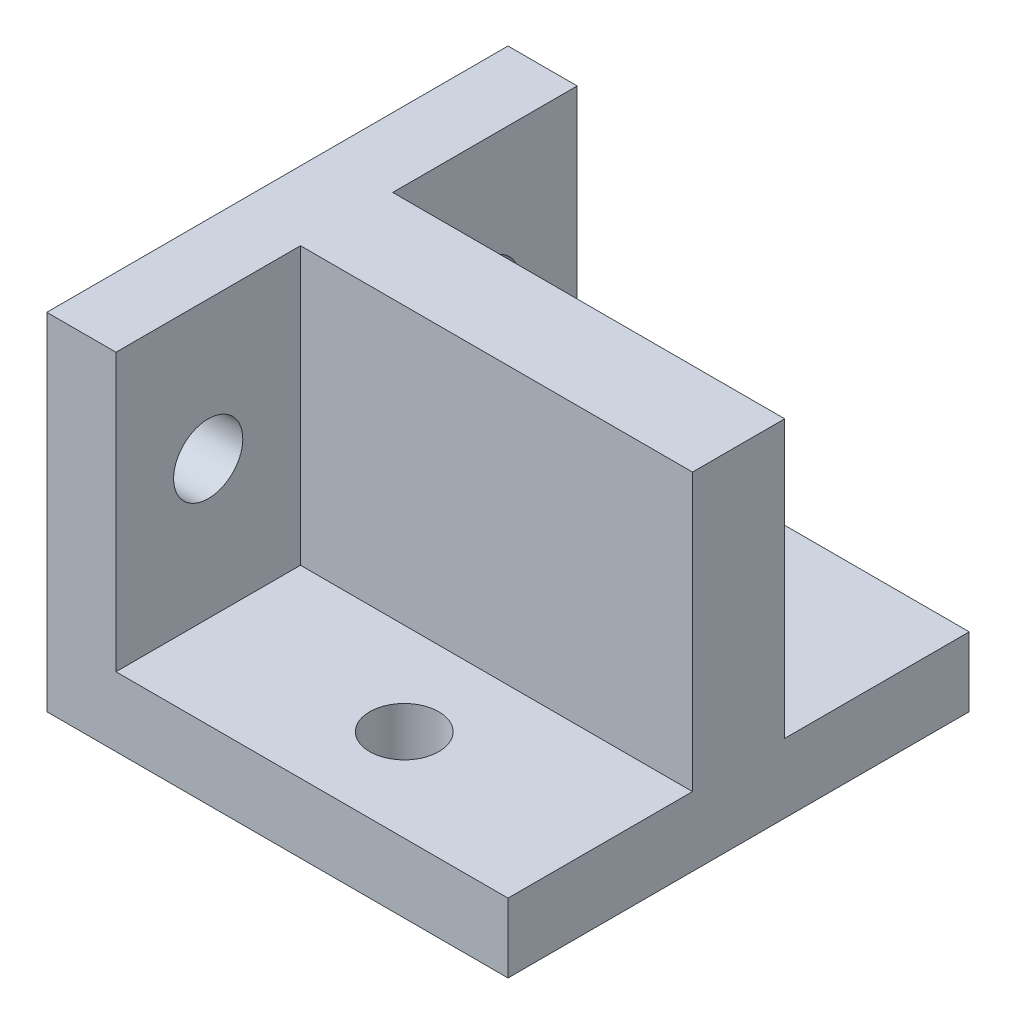
ISO-10303-21;
HEADER;
FILE_DESCRIPTION(('STEP AP214'),'2;1');
FILE_NAME('part.step','',(''),(''),'','','');
FILE_SCHEMA(('AUTOMOTIVE_DESIGN { 1 0 10303 214 1 1 1 1 }'));
ENDSEC;
DATA;
#1=APPLICATION_CONTEXT('core data for automotive mechanical design processes');
#2=APPLICATION_PROTOCOL_DEFINITION('international standard','automotive_design',2000,#1);
#3=PRODUCT_CONTEXT('',#1,'mechanical');
#4=PRODUCT('Part','Part','',(#3));
#5=PRODUCT_RELATED_PRODUCT_CATEGORY('part','',(#4));
#6=PRODUCT_DEFINITION_FORMATION('','',#4);
#7=PRODUCT_DEFINITION_CONTEXT('part definition',#1,'design');
#8=PRODUCT_DEFINITION('design','',#6,#7);
#9=PRODUCT_DEFINITION_SHAPE('','',#8);
#10=(LENGTH_UNIT() NAMED_UNIT(*) SI_UNIT(.MILLI.,.METRE.));
#11=(NAMED_UNIT(*) PLANE_ANGLE_UNIT() SI_UNIT($,.RADIAN.));
#12=(NAMED_UNIT(*) SI_UNIT($,.STERADIAN.) SOLID_ANGLE_UNIT());
#13=UNCERTAINTY_MEASURE_WITH_UNIT(LENGTH_MEASURE(1.E-05),#10,'distance_accuracy_value','');
#14=(GEOMETRIC_REPRESENTATION_CONTEXT(3) GLOBAL_UNCERTAINTY_ASSIGNED_CONTEXT((#13)) GLOBAL_UNIT_ASSIGNED_CONTEXT((#10,
#11,#12)) REPRESENTATION_CONTEXT('',''));
#15=CARTESIAN_POINT('',(0.,0.,0.));
#16=DIRECTION('',(0.,0.,1.));
#17=DIRECTION('',(1.,0.,0.));
#18=AXIS2_PLACEMENT_3D('',#15,#16,#17);
#19=CARTESIAN_POINT('',(17.,0.,20.));
#20=DIRECTION('',(0.,-1.,0.));
#21=DIRECTION('',(1.,0.,0.));
#22=AXIS2_PLACEMENT_3D('',#19,#20,#21);
#23=PLANE('',#22);
#24=CARTESIAN_POINT('',(8.5,0.,4.));
#25=DIRECTION('',(0.,1.,0.));
#26=DIRECTION('',(1.,0.,0.));
#27=AXIS2_PLACEMENT_3D('',#24,#25,#26);
#28=CIRCLE('',#27,1.5);
#29=CARTESIAN_POINT('',(10.,0.,4.));
#30=VERTEX_POINT('',#29);
#31=EDGE_CURVE('E161',#30,#30,#28,.T.);
#32=ORIENTED_EDGE('',*,*,#31,.F.);
#33=EDGE_LOOP('',(#32));
#34=FACE_BOUND('',#33,.T.);
#35=DIRECTION('',(-1.,0.,0.));
#36=VECTOR('',#35,1.);
#37=CARTESIAN_POINT('',(29.6491106406735,0.,8.));
#38=LINE('',#37,#36);
#39=CARTESIAN_POINT('',(17.,0.,8.));
#40=VERTEX_POINT('',#39);
#41=CARTESIAN_POINT('',(0.,0.,8.));
#42=VERTEX_POINT('',#41);
#43=EDGE_CURVE('E135',#40,#42,#38,.T.);
#44=ORIENTED_EDGE('',*,*,#43,.F.);
#45=DIRECTION('',(0.,0.,-1.));
#46=VECTOR('',#45,1.);
#47=CARTESIAN_POINT('',(17.,0.,20.));
#48=LINE('',#47,#46);
#49=CARTESIAN_POINT('',(17.,0.,0.));
#50=VERTEX_POINT('',#49);
#51=EDGE_CURVE('E123',#40,#50,#48,.T.);
#52=ORIENTED_EDGE('',*,*,#51,.T.);
#53=DIRECTION('',(-1.,0.,0.));
#54=VECTOR('',#53,1.);
#55=CARTESIAN_POINT('',(17.,0.,0.));
#56=LINE('',#55,#54);
#57=CARTESIAN_POINT('',(0.,0.,0.));
#58=VERTEX_POINT('',#57);
#59=EDGE_CURVE('E169',#50,#58,#56,.T.);
#60=ORIENTED_EDGE('',*,*,#59,.T.);
#61=DIRECTION('',(0.,0.,-1.));
#62=VECTOR('',#61,1.);
#63=CARTESIAN_POINT('',(0.,0.,20.));
#64=LINE('',#63,#62);
#65=EDGE_CURVE('E47',#42,#58,#64,.T.);
#66=ORIENTED_EDGE('',*,*,#65,.F.);
#67=EDGE_LOOP('',(#44,#52,#60,#66));
#68=FACE_BOUND('',#67,.T.);
#69=ADVANCED_FACE('F39',(#34,#68),#23,.F.);
#70=CARTESIAN_POINT('',(8.5,0.,16.));
#71=DIRECTION('',(0.,1.,0.));
#72=DIRECTION('',(-1.,0.,0.));
#73=AXIS2_PLACEMENT_3D('',#70,#71,#72);
#74=CIRCLE('',#73,1.5);
#75=CARTESIAN_POINT('',(7.,0.,16.));
#76=VERTEX_POINT('',#75);
#77=EDGE_CURVE('E153',#76,#76,#74,.T.);
#78=ORIENTED_EDGE('',*,*,#77,.F.);
#79=EDGE_LOOP('',(#78));
#80=FACE_BOUND('',#79,.T.);
#81=DIRECTION('',(-1.,0.,0.));
#82=VECTOR('',#81,1.);
#83=CARTESIAN_POINT('',(29.6491106406735,0.,12.));
#84=LINE('',#83,#82);
#85=CARTESIAN_POINT('',(17.,0.,12.));
#86=VERTEX_POINT('',#85);
#87=CARTESIAN_POINT('',(0.,0.,12.));
#88=VERTEX_POINT('',#87);
#89=EDGE_CURVE('E62',#86,#88,#84,.T.);
#90=ORIENTED_EDGE('',*,*,#89,.T.);
#91=CARTESIAN_POINT('',(0.,0.,20.));
#92=VERTEX_POINT('',#91);
#93=EDGE_CURVE('E11',#92,#88,#64,.T.);
#94=ORIENTED_EDGE('',*,*,#93,.F.);
#95=DIRECTION('',(-1.,0.,0.));
#96=VECTOR('',#95,1.);
#97=CARTESIAN_POINT('',(17.,0.,20.));
#98=LINE('',#97,#96);
#99=CARTESIAN_POINT('',(17.,0.,20.));
#100=VERTEX_POINT('',#99);
#101=EDGE_CURVE('E181',#100,#92,#98,.T.);
#102=ORIENTED_EDGE('',*,*,#101,.F.);
#103=EDGE_CURVE('E219',#100,#86,#48,.T.);
#104=ORIENTED_EDGE('',*,*,#103,.T.);
#105=EDGE_LOOP('',(#90,#94,#102,#104));
#106=FACE_BOUND('',#105,.T.);
#107=ADVANCED_FACE('F277',(#80,#106),#23,.F.);
#108=CARTESIAN_POINT('',(0.,0.,20.));
#109=DIRECTION('',(-1.,0.,0.));
#110=DIRECTION('',(0.,-1.,0.));
#111=AXIS2_PLACEMENT_3D('',#108,#109,#110);
#112=PLANE('',#111);
#113=CARTESIAN_POINT('',(0.,6.,4.));
#114=DIRECTION('',(1.,0.,0.));
#115=DIRECTION('',(0.,-1.,0.));
#116=AXIS2_PLACEMENT_3D('',#113,#114,#115);
#117=CIRCLE('',#116,1.5);
#118=CARTESIAN_POINT('',(0.,4.5,4.));
#119=VERTEX_POINT('',#118);
#120=EDGE_CURVE('E152',#119,#119,#117,.T.);
#121=ORIENTED_EDGE('',*,*,#120,.F.);
#122=EDGE_LOOP('',(#121));
#123=FACE_BOUND('',#122,.T.);
#124=DIRECTION('',(0.,1.,0.));
#125=VECTOR('',#124,1.);
#126=CARTESIAN_POINT('',(0.,12.,8.));
#127=LINE('',#126,#125);
#128=CARTESIAN_POINT('',(0.,12.,8.));
#129=VERTEX_POINT('',#128);
#130=EDGE_CURVE('E54',#42,#129,#127,.T.);
#131=ORIENTED_EDGE('',*,*,#130,.F.);
#132=ORIENTED_EDGE('',*,*,#65,.T.);
#133=DIRECTION('',(0.,1.,0.));
#134=VECTOR('',#133,1.);
#135=CARTESIAN_POINT('',(0.,0.,0.));
#136=LINE('',#135,#134);
#137=CARTESIAN_POINT('',(0.,12.,0.));
#138=VERTEX_POINT('',#137);
#139=EDGE_CURVE('E204',#58,#138,#136,.T.);
#140=ORIENTED_EDGE('',*,*,#139,.T.);
#141=DIRECTION('',(0.,0.,-1.));
#142=VECTOR('',#141,1.);
#143=CARTESIAN_POINT('',(0.,12.,20.));
#144=LINE('',#143,#142);
#145=EDGE_CURVE('E233',#129,#138,#144,.T.);
#146=ORIENTED_EDGE('',*,*,#145,.F.);
#147=EDGE_LOOP('',(#131,#132,#140,#146));
#148=FACE_BOUND('',#147,.T.);
#149=ADVANCED_FACE('F243',(#123,#148),#112,.F.);
#150=CARTESIAN_POINT('',(0.,6.,16.));
#151=DIRECTION('',(1.,0.,0.));
#152=DIRECTION('',(0.,1.,0.));
#153=AXIS2_PLACEMENT_3D('',#150,#151,#152);
#154=CIRCLE('',#153,1.5);
#155=CARTESIAN_POINT('',(0.,7.5,16.));
#156=VERTEX_POINT('',#155);
#157=EDGE_CURVE('E170',#156,#156,#154,.T.);
#158=ORIENTED_EDGE('',*,*,#157,.F.);
#159=EDGE_LOOP('',(#158));
#160=FACE_BOUND('',#159,.T.);
#161=DIRECTION('',(0.,-1.,0.));
#162=VECTOR('',#161,1.);
#163=CARTESIAN_POINT('',(0.,12.,12.));
#164=LINE('',#163,#162);
#165=CARTESIAN_POINT('',(0.,12.,12.));
#166=VERTEX_POINT('',#165);
#167=EDGE_CURVE('E266',#166,#88,#164,.T.);
#168=ORIENTED_EDGE('',*,*,#167,.F.);
#169=CARTESIAN_POINT('',(0.,12.,20.));
#170=VERTEX_POINT('',#169);
#171=EDGE_CURVE('E234',#170,#166,#144,.T.);
#172=ORIENTED_EDGE('',*,*,#171,.F.);
#173=DIRECTION('',(0.,1.,0.));
#174=VECTOR('',#173,1.);
#175=CARTESIAN_POINT('',(0.,0.,20.));
#176=LINE('',#175,#174);
#177=EDGE_CURVE('E185',#92,#170,#176,.T.);
#178=ORIENTED_EDGE('',*,*,#177,.F.);
#179=ORIENTED_EDGE('',*,*,#93,.T.);
#180=EDGE_LOOP('',(#168,#172,#178,#179));
#181=FACE_BOUND('',#180,.T.);
#182=ADVANCED_FACE('F264',(#160,#181),#112,.F.);
#183=CARTESIAN_POINT('',(0.,12.,20.));
#184=DIRECTION('',(0.,-1.,0.));
#185=DIRECTION('',(1.,0.,0.));
#186=AXIS2_PLACEMENT_3D('',#183,#184,#185);
#187=PLANE('',#186);
#188=DIRECTION('',(-1.,0.,0.));
#189=VECTOR('',#188,1.);
#190=CARTESIAN_POINT('',(0.,12.,0.));
#191=LINE('',#190,#189);
#192=CARTESIAN_POINT('',(-3.,12.,0.));
#193=VERTEX_POINT('',#192);
#194=EDGE_CURVE('E208',#138,#193,#191,.T.);
#195=ORIENTED_EDGE('',*,*,#194,.T.);
#196=DIRECTION('',(0.,0.,-1.));
#197=VECTOR('',#196,1.);
#198=CARTESIAN_POINT('',(-3.,12.,20.));
#199=LINE('',#198,#197);
#200=CARTESIAN_POINT('',(-3.,12.,20.));
#201=VERTEX_POINT('',#200);
#202=EDGE_CURVE('E230',#201,#193,#199,.T.);
#203=ORIENTED_EDGE('',*,*,#202,.F.);
#204=DIRECTION('',(-1.,0.,0.));
#205=VECTOR('',#204,1.);
#206=CARTESIAN_POINT('',(0.,12.,20.));
#207=LINE('',#206,#205);
#208=EDGE_CURVE('E189',#170,#201,#207,.T.);
#209=ORIENTED_EDGE('',*,*,#208,.F.);
#210=ORIENTED_EDGE('',*,*,#171,.T.);
#211=DIRECTION('',(-1.,0.,0.));
#212=VECTOR('',#211,1.);
#213=CARTESIAN_POINT('',(29.6491106406735,12.,12.));
#214=LINE('',#213,#212);
#215=CARTESIAN_POINT('',(17.,12.,12.));
#216=VERTEX_POINT('',#215);
#217=EDGE_CURVE('E136',#216,#166,#214,.T.);
#218=ORIENTED_EDGE('',*,*,#217,.F.);
#219=DIRECTION('',(0.,0.,-1.));
#220=VECTOR('',#219,1.);
#221=CARTESIAN_POINT('',(17.,12.,12.));
#222=LINE('',#221,#220);
#223=CARTESIAN_POINT('',(17.,12.,8.));
#224=VERTEX_POINT('',#223);
#225=EDGE_CURVE('E121',#216,#224,#222,.T.);
#226=ORIENTED_EDGE('',*,*,#225,.T.);
#227=DIRECTION('',(-1.,0.,0.));
#228=VECTOR('',#227,1.);
#229=CARTESIAN_POINT('',(29.6491106406735,12.,8.));
#230=LINE('',#229,#228);
#231=EDGE_CURVE('E131',#224,#129,#230,.T.);
#232=ORIENTED_EDGE('',*,*,#231,.T.);
#233=ORIENTED_EDGE('',*,*,#145,.T.);
#234=EDGE_LOOP('',(#195,#203,#209,#210,#218,#226,#232,#233));
#235=FACE_BOUND('',#234,.T.);
#236=ADVANCED_FACE('F139',(#235),#187,.F.);
#237=CARTESIAN_POINT('',(-3.,12.,20.));
#238=DIRECTION('',(1.,0.,0.));
#239=DIRECTION('',(0.,1.,0.));
#240=AXIS2_PLACEMENT_3D('',#237,#238,#239);
#241=PLANE('',#240);
#242=CARTESIAN_POINT('',(-3.,6.,16.));
#243=DIRECTION('',(1.,0.,0.));
#244=DIRECTION('',(0.,1.,0.));
#245=AXIS2_PLACEMENT_3D('',#242,#243,#244);
#246=CIRCLE('',#245,1.5);
#247=CARTESIAN_POINT('',(-3.,7.5,16.));
#248=VERTEX_POINT('',#247);
#249=EDGE_CURVE('E165',#248,#248,#246,.T.);
#250=ORIENTED_EDGE('',*,*,#249,.T.);
#251=EDGE_LOOP('',(#250));
#252=FACE_BOUND('',#251,.T.);
#253=CARTESIAN_POINT('',(-3.,6.,4.));
#254=DIRECTION('',(1.,0.,0.));
#255=DIRECTION('',(0.,-1.,0.));
#256=AXIS2_PLACEMENT_3D('',#253,#254,#255);
#257=CIRCLE('',#256,1.5);
#258=CARTESIAN_POINT('',(-3.,4.5,4.));
#259=VERTEX_POINT('',#258);
#260=EDGE_CURVE('E174',#259,#259,#257,.T.);
#261=ORIENTED_EDGE('',*,*,#260,.T.);
#262=EDGE_LOOP('',(#261));
#263=FACE_BOUND('',#262,.T.);
#264=DIRECTION('',(0.,-1.,0.));
#265=VECTOR('',#264,1.);
#266=CARTESIAN_POINT('',(-3.,12.,0.));
#267=LINE('',#266,#265);
#268=CARTESIAN_POINT('',(-3.,-3.,0.));
#269=VERTEX_POINT('',#268);
#270=EDGE_CURVE('E211',#193,#269,#267,.T.);
#271=ORIENTED_EDGE('',*,*,#270,.T.);
#272=DIRECTION('',(0.,0.,-1.));
#273=VECTOR('',#272,1.);
#274=CARTESIAN_POINT('',(-3.,-3.,20.));
#275=LINE('',#274,#273);
#276=CARTESIAN_POINT('',(-3.,-3.,20.));
#277=VERTEX_POINT('',#276);
#278=EDGE_CURVE('E226',#277,#269,#275,.T.);
#279=ORIENTED_EDGE('',*,*,#278,.F.);
#280=DIRECTION('',(0.,-1.,0.));
#281=VECTOR('',#280,1.);
#282=CARTESIAN_POINT('',(-3.,12.,20.));
#283=LINE('',#282,#281);
#284=EDGE_CURVE('E192',#201,#277,#283,.T.);
#285=ORIENTED_EDGE('',*,*,#284,.F.);
#286=ORIENTED_EDGE('',*,*,#202,.T.);
#287=EDGE_LOOP('',(#271,#279,#285,#286));
#288=FACE_BOUND('',#287,.T.);
#289=ADVANCED_FACE('F252',(#252,#263,#288),#241,.F.);
#290=CARTESIAN_POINT('',(-3.,-3.,20.));
#291=DIRECTION('',(0.,1.,0.));
#292=DIRECTION('',(-1.,0.,0.));
#293=AXIS2_PLACEMENT_3D('',#290,#291,#292);
#294=PLANE('',#293);
#295=CARTESIAN_POINT('',(8.5,-3.,16.));
#296=DIRECTION('',(0.,1.,0.));
#297=DIRECTION('',(-1.,0.,0.));
#298=AXIS2_PLACEMENT_3D('',#295,#296,#297);
#299=CIRCLE('',#298,1.5);
#300=CARTESIAN_POINT('',(7.,-3.,16.));
#301=VERTEX_POINT('',#300);
#302=EDGE_CURVE('E148',#301,#301,#299,.T.);
#303=ORIENTED_EDGE('',*,*,#302,.T.);
#304=EDGE_LOOP('',(#303));
#305=FACE_BOUND('',#304,.T.);
#306=CARTESIAN_POINT('',(8.5,-3.,4.));
#307=DIRECTION('',(0.,1.,0.));
#308=DIRECTION('',(1.,0.,0.));
#309=AXIS2_PLACEMENT_3D('',#306,#307,#308);
#310=CIRCLE('',#309,1.5);
#311=CARTESIAN_POINT('',(10.,-3.,4.));
#312=VERTEX_POINT('',#311);
#313=EDGE_CURVE('E157',#312,#312,#310,.T.);
#314=ORIENTED_EDGE('',*,*,#313,.T.);
#315=EDGE_LOOP('',(#314));
#316=FACE_BOUND('',#315,.T.);
#317=DIRECTION('',(1.,0.,0.));
#318=VECTOR('',#317,1.);
#319=CARTESIAN_POINT('',(-3.,-3.,0.));
#320=LINE('',#319,#318);
#321=CARTESIAN_POINT('',(17.,-3.,0.));
#322=VERTEX_POINT('',#321);
#323=EDGE_CURVE('E214',#269,#322,#320,.T.);
#324=ORIENTED_EDGE('',*,*,#323,.T.);
#325=DIRECTION('',(0.,0.,-1.));
#326=VECTOR('',#325,1.);
#327=CARTESIAN_POINT('',(17.,-3.,20.));
#328=LINE('',#327,#326);
#329=CARTESIAN_POINT('',(17.,-3.,20.));
#330=VERTEX_POINT('',#329);
#331=EDGE_CURVE('E222',#330,#322,#328,.T.);
#332=ORIENTED_EDGE('',*,*,#331,.F.);
#333=DIRECTION('',(1.,0.,0.));
#334=VECTOR('',#333,1.);
#335=CARTESIAN_POINT('',(-3.,-3.,20.));
#336=LINE('',#335,#334);
#337=EDGE_CURVE('E195',#277,#330,#336,.T.);
#338=ORIENTED_EDGE('',*,*,#337,.F.);
#339=ORIENTED_EDGE('',*,*,#278,.T.);
#340=EDGE_LOOP('',(#324,#332,#338,#339));
#341=FACE_BOUND('',#340,.T.);
#342=ADVANCED_FACE('F256',(#305,#316,#341),#294,.F.);
#343=CARTESIAN_POINT('',(17.,-3.,20.));
#344=DIRECTION('',(-1.,0.,0.));
#345=DIRECTION('',(0.,0.,1.));
#346=AXIS2_PLACEMENT_3D('',#343,#344,#345);
#347=PLANE('',#346);
#348=DIRECTION('',(0.,1.,0.));
#349=VECTOR('',#348,1.);
#350=CARTESIAN_POINT('',(17.,-3.,0.));
#351=LINE('',#350,#349);
#352=EDGE_CURVE('E186',#322,#50,#351,.T.);
#353=ORIENTED_EDGE('',*,*,#352,.T.);
#354=ORIENTED_EDGE('',*,*,#51,.F.);
#355=DIRECTION('',(0.,-1.,0.));
#356=VECTOR('',#355,1.);
#357=CARTESIAN_POINT('',(17.,12.,8.));
#358=LINE('',#357,#356);
#359=EDGE_CURVE('E115',#224,#40,#358,.T.);
#360=ORIENTED_EDGE('',*,*,#359,.F.);
#361=ORIENTED_EDGE('',*,*,#225,.F.);
#362=DIRECTION('',(0.,1.,0.));
#363=VECTOR('',#362,1.);
#364=CARTESIAN_POINT('',(17.,12.,12.));
#365=LINE('',#364,#363);
#366=EDGE_CURVE('E128',#86,#216,#365,.T.);
#367=ORIENTED_EDGE('',*,*,#366,.F.);
#368=ORIENTED_EDGE('',*,*,#103,.F.);
#369=DIRECTION('',(0.,1.,0.));
#370=VECTOR('',#369,1.);
#371=CARTESIAN_POINT('',(17.,-3.,20.));
#372=LINE('',#371,#370);
#373=EDGE_CURVE('E198',#330,#100,#372,.T.);
#374=ORIENTED_EDGE('',*,*,#373,.F.);
#375=ORIENTED_EDGE('',*,*,#331,.T.);
#376=EDGE_LOOP('',(#353,#354,#360,#361,#367,#368,#374,#375));
#377=FACE_BOUND('',#376,.T.);
#378=ADVANCED_FACE('F118',(#377),#347,.F.);
#379=CARTESIAN_POINT('',(0.,0.,20.));
#380=DIRECTION('',(0.,0.,-1.));
#381=DIRECTION('',(-1.,0.,0.));
#382=AXIS2_PLACEMENT_3D('',#379,#380,#381);
#383=PLANE('',#382);
#384=ORIENTED_EDGE('',*,*,#101,.T.);
#385=ORIENTED_EDGE('',*,*,#177,.T.);
#386=ORIENTED_EDGE('',*,*,#208,.T.);
#387=ORIENTED_EDGE('',*,*,#284,.T.);
#388=ORIENTED_EDGE('',*,*,#337,.T.);
#389=ORIENTED_EDGE('',*,*,#373,.T.);
#390=EDGE_LOOP('',(#384,#385,#386,#387,#388,#389));
#391=FACE_BOUND('',#390,.T.);
#392=ADVANCED_FACE('F260',(#391),#383,.F.);
#393=CARTESIAN_POINT('',(0.,0.,0.));
#394=DIRECTION('',(0.,0.,-1.));
#395=DIRECTION('',(-1.,0.,0.));
#396=AXIS2_PLACEMENT_3D('',#393,#394,#395);
#397=PLANE('',#396);
#398=ORIENTED_EDGE('',*,*,#59,.F.);
#399=ORIENTED_EDGE('',*,*,#352,.F.);
#400=ORIENTED_EDGE('',*,*,#323,.F.);
#401=ORIENTED_EDGE('',*,*,#270,.F.);
#402=ORIENTED_EDGE('',*,*,#194,.F.);
#403=ORIENTED_EDGE('',*,*,#139,.F.);
#404=EDGE_LOOP('',(#398,#399,#400,#401,#402,#403));
#405=FACE_BOUND('',#404,.T.);
#406=ADVANCED_FACE('F247',(#405),#397,.T.);
#407=CARTESIAN_POINT('',(-3.,6.,4.));
#408=DIRECTION('',(1.,0.,0.));
#409=DIRECTION('',(0.,1.,0.));
#410=AXIS2_PLACEMENT_3D('',#407,#408,#409);
#411=CYLINDRICAL_SURFACE('',#410,1.5);
#412=ORIENTED_EDGE('',*,*,#260,.F.);
#413=EDGE_LOOP('',(#412));
#414=FACE_BOUND('',#413,.T.);
#415=ORIENTED_EDGE('',*,*,#120,.T.);
#416=EDGE_LOOP('',(#415));
#417=FACE_BOUND('',#416,.T.);
#418=ADVANCED_FACE('F308',(#414,#417),#411,.F.);
#419=CARTESIAN_POINT('',(-3.,6.,16.));
#420=DIRECTION('',(1.,0.,0.));
#421=DIRECTION('',(0.,1.,0.));
#422=AXIS2_PLACEMENT_3D('',#419,#420,#421);
#423=CYLINDRICAL_SURFACE('',#422,1.5);
#424=ORIENTED_EDGE('',*,*,#249,.F.);
#425=EDGE_LOOP('',(#424));
#426=FACE_BOUND('',#425,.T.);
#427=ORIENTED_EDGE('',*,*,#157,.T.);
#428=EDGE_LOOP('',(#427));
#429=FACE_BOUND('',#428,.T.);
#430=ADVANCED_FACE('F300',(#426,#429),#423,.F.);
#431=CARTESIAN_POINT('',(8.5,-3.,4.));
#432=DIRECTION('',(0.,1.,0.));
#433=DIRECTION('',(-1.,0.,0.));
#434=AXIS2_PLACEMENT_3D('',#431,#432,#433);
#435=CYLINDRICAL_SURFACE('',#434,1.5);
#436=ORIENTED_EDGE('',*,*,#313,.F.);
#437=EDGE_LOOP('',(#436));
#438=FACE_BOUND('',#437,.T.);
#439=ORIENTED_EDGE('',*,*,#31,.T.);
#440=EDGE_LOOP('',(#439));
#441=FACE_BOUND('',#440,.T.);
#442=ADVANCED_FACE('F290',(#438,#441),#435,.F.);
#443=CARTESIAN_POINT('',(8.5,-3.,16.));
#444=DIRECTION('',(0.,1.,0.));
#445=DIRECTION('',(-1.,0.,0.));
#446=AXIS2_PLACEMENT_3D('',#443,#444,#445);
#447=CYLINDRICAL_SURFACE('',#446,1.5);
#448=ORIENTED_EDGE('',*,*,#302,.F.);
#449=EDGE_LOOP('',(#448));
#450=FACE_BOUND('',#449,.T.);
#451=ORIENTED_EDGE('',*,*,#77,.T.);
#452=EDGE_LOOP('',(#451));
#453=FACE_BOUND('',#452,.T.);
#454=ADVANCED_FACE('F288',(#450,#453),#447,.F.);
#455=CARTESIAN_POINT('',(29.6491106406735,12.,8.));
#456=DIRECTION('',(0.,0.,1.));
#457=DIRECTION('',(0.,-1.,0.));
#458=AXIS2_PLACEMENT_3D('',#455,#456,#457);
#459=PLANE('',#458);
#460=ORIENTED_EDGE('',*,*,#231,.F.);
#461=ORIENTED_EDGE('',*,*,#359,.T.);
#462=ORIENTED_EDGE('',*,*,#43,.T.);
#463=ORIENTED_EDGE('',*,*,#130,.T.);
#464=EDGE_LOOP('',(#460,#461,#462,#463));
#465=FACE_BOUND('',#464,.T.);
#466=ADVANCED_FACE('F132',(#465),#459,.F.);
#467=CARTESIAN_POINT('',(29.6491106406735,12.,12.));
#468=DIRECTION('',(0.,0.,-1.));
#469=DIRECTION('',(0.,1.,0.));
#470=AXIS2_PLACEMENT_3D('',#467,#468,#469);
#471=PLANE('',#470);
#472=ORIENTED_EDGE('',*,*,#89,.F.);
#473=ORIENTED_EDGE('',*,*,#366,.T.);
#474=ORIENTED_EDGE('',*,*,#217,.T.);
#475=ORIENTED_EDGE('',*,*,#167,.T.);
#476=EDGE_LOOP('',(#472,#473,#474,#475));
#477=FACE_BOUND('',#476,.T.);
#478=ADVANCED_FACE('F298',(#477),#471,.F.);
#479=CLOSED_SHELL('',(#69,#107,#149,#182,#236,#289,#342,#378,#392,#406,#418,#430,#442,#454,#466,#478));
#480=MANIFOLD_SOLID_BREP('B2',#479);
#481=ADVANCED_BREP_SHAPE_REPRESENTATION('',(#18,#480),#14);
#482=SHAPE_DEFINITION_REPRESENTATION(#9,#481);
ENDSEC;
END-ISO-10303-21;
